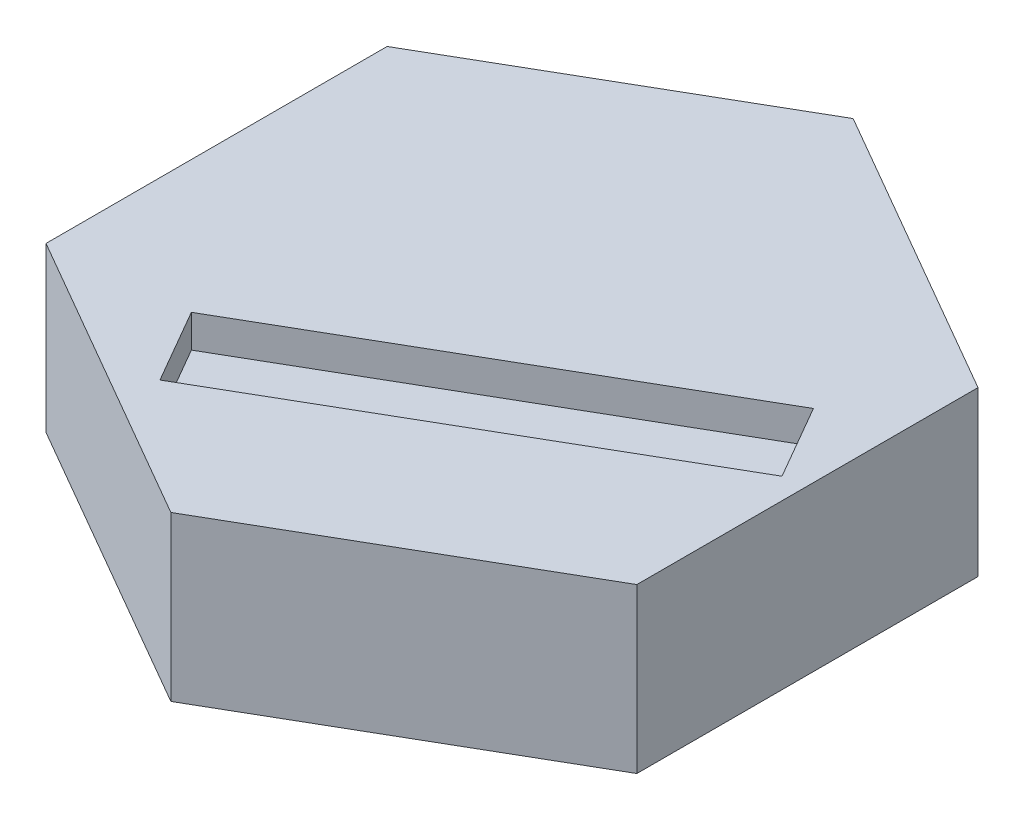
ISO-10303-21;
HEADER;
FILE_DESCRIPTION(('STEP AP214'),'2;1');
FILE_NAME('part.step','',(''),(''),'','','');
FILE_SCHEMA(('AUTOMOTIVE_DESIGN { 1 0 10303 214 1 1 1 1 }'));
ENDSEC;
DATA;
#1=APPLICATION_CONTEXT('core data for automotive mechanical design processes');
#2=APPLICATION_PROTOCOL_DEFINITION('international standard','automotive_design',2000,#1);
#3=PRODUCT_CONTEXT('',#1,'mechanical');
#4=PRODUCT('Part','Part','',(#3));
#5=PRODUCT_RELATED_PRODUCT_CATEGORY('part','',(#4));
#6=PRODUCT_DEFINITION_FORMATION('','',#4);
#7=PRODUCT_DEFINITION_CONTEXT('part definition',#1,'design');
#8=PRODUCT_DEFINITION('design','',#6,#7);
#9=PRODUCT_DEFINITION_SHAPE('','',#8);
#10=(LENGTH_UNIT() NAMED_UNIT(*) SI_UNIT(.MILLI.,.METRE.));
#11=(NAMED_UNIT(*) PLANE_ANGLE_UNIT() SI_UNIT($,.RADIAN.));
#12=(NAMED_UNIT(*) SI_UNIT($,.STERADIAN.) SOLID_ANGLE_UNIT());
#13=UNCERTAINTY_MEASURE_WITH_UNIT(LENGTH_MEASURE(1.E-05),#10,'distance_accuracy_value','');
#14=(GEOMETRIC_REPRESENTATION_CONTEXT(3) GLOBAL_UNCERTAINTY_ASSIGNED_CONTEXT((#13)) GLOBAL_UNIT_ASSIGNED_CONTEXT((#10,
#11,#12)) REPRESENTATION_CONTEXT('',''));
#15=CARTESIAN_POINT('',(0.,0.,0.));
#16=DIRECTION('',(0.,0.,1.));
#17=DIRECTION('',(1.,0.,0.));
#18=AXIS2_PLACEMENT_3D('',#15,#16,#17);
#19=CARTESIAN_POINT('',(0.,5.,0.));
#20=DIRECTION('',(0.,1.,0.));
#21=DIRECTION('',(0.,0.,1.));
#22=AXIS2_PLACEMENT_3D('',#19,#20,#21);
#23=PLANE('',#22);
#24=DIRECTION('',(0.,0.,-1.));
#25=VECTOR('',#24,1.);
#26=CARTESIAN_POINT('',(9.025,5.,5.21058617943637));
#27=LINE('',#26,#25);
#28=CARTESIAN_POINT('',(9.025,5.,5.21058617943637));
#29=VERTEX_POINT('',#28);
#30=CARTESIAN_POINT('',(9.025,5.,-5.21058617943637));
#31=VERTEX_POINT('',#30);
#32=EDGE_CURVE('E442',#29,#31,#27,.T.);
#33=ORIENTED_EDGE('',*,*,#32,.T.);
#34=DIRECTION('',(-0.866025403784439,0.,-0.5));
#35=VECTOR('',#34,1.);
#36=CARTESIAN_POINT('',(9.025,5.,-5.21058617943637));
#37=LINE('',#36,#35);
#38=CARTESIAN_POINT('',(0.,5.,-10.4211723588727));
#39=VERTEX_POINT('',#38);
#40=EDGE_CURVE('E445',#31,#39,#37,.T.);
#41=ORIENTED_EDGE('',*,*,#40,.T.);
#42=DIRECTION('',(-0.866025403784439,0.,0.5));
#43=VECTOR('',#42,1.);
#44=CARTESIAN_POINT('',(0.,5.,-10.4211723588727));
#45=LINE('',#44,#43);
#46=CARTESIAN_POINT('',(-9.025,5.,-5.21058617943638));
#47=VERTEX_POINT('',#46);
#48=EDGE_CURVE('E448',#39,#47,#45,.T.);
#49=ORIENTED_EDGE('',*,*,#48,.T.);
#50=DIRECTION('',(0.,0.,1.));
#51=VECTOR('',#50,1.);
#52=CARTESIAN_POINT('',(-9.025,5.,-5.21058617943638));
#53=LINE('',#52,#51);
#54=CARTESIAN_POINT('',(-9.025,5.,5.21058617943638));
#55=VERTEX_POINT('',#54);
#56=EDGE_CURVE('E450',#47,#55,#53,.T.);
#57=ORIENTED_EDGE('',*,*,#56,.T.);
#58=DIRECTION('',(0.866025403784439,0.,0.5));
#59=VECTOR('',#58,1.);
#60=CARTESIAN_POINT('',(-9.025,5.,5.21058617943638));
#61=LINE('',#60,#59);
#62=CARTESIAN_POINT('',(0.,5.,10.4211723588727));
#63=VERTEX_POINT('',#62);
#64=EDGE_CURVE('E452',#55,#63,#61,.T.);
#65=ORIENTED_EDGE('',*,*,#64,.T.);
#66=DIRECTION('',(0.866025403784439,0.,-0.5));
#67=VECTOR('',#66,1.);
#68=CARTESIAN_POINT('',(0.,5.,10.4211723588727));
#69=LINE('',#68,#67);
#70=EDGE_CURVE('E454',#63,#29,#69,.T.);
#71=ORIENTED_EDGE('',*,*,#70,.T.);
#72=EDGE_LOOP('',(#33,#41,#49,#57,#65,#71));
#73=FACE_BOUND('',#72,.T.);
#74=DIRECTION('',(-0.865938535675838,0.,0.500150429802459));
#75=VECTOR('',#74,1.);
#76=CARTESIAN_POINT('',(8.3754609018656,5.,0.127158722187314));
#77=LINE('',#76,#75);
#78=CARTESIAN_POINT('',(8.3754609018656,5.,0.127158722187314));
#79=VERTEX_POINT('',#78);
#80=CARTESIAN_POINT('',(-3.66981153403183,5.,7.08429013244372));
#81=VERTEX_POINT('',#80);
#82=EDGE_CURVE('E259',#79,#81,#77,.T.);
#83=ORIENTED_EDGE('',*,*,#82,.T.);
#84=DIRECTION('',(-0.500163094740808,0.,-0.865931220513094));
#85=VECTOR('',#84,1.);
#86=CARTESIAN_POINT('',(-3.66981153403183,5.,7.08429013244372));
#87=LINE('',#86,#85);
#88=CARTESIAN_POINT('',(-4.98191089300619,5.,4.81265551705911));
#89=VERTEX_POINT('',#88);
#90=EDGE_CURVE('E50',#81,#89,#87,.T.);
#91=ORIENTED_EDGE('',*,*,#90,.T.);
#92=DIRECTION('',(0.865938535675838,0.,-0.500150429802459));
#93=VECTOR('',#92,1.);
#94=CARTESIAN_POINT('',(-4.98191089300619,5.,4.81265551705911));
#95=LINE('',#94,#93);
#96=CARTESIAN_POINT('',(7.06336154289125,5.,-2.1444758931973));
#97=VERTEX_POINT('',#96);
#98=EDGE_CURVE('E263',#89,#97,#95,.T.);
#99=ORIENTED_EDGE('',*,*,#98,.T.);
#100=DIRECTION('',(0.500163094740808,0.,0.865931220513094));
#101=VECTOR('',#100,1.);
#102=CARTESIAN_POINT('',(7.06336154289125,5.,-2.1444758931973));
#103=LINE('',#102,#101);
#104=EDGE_CURVE('E885',#97,#79,#103,.T.);
#105=ORIENTED_EDGE('',*,*,#104,.T.);
#106=EDGE_LOOP('',(#83,#91,#99,#105));
#107=FACE_BOUND('',#106,.T.);
#108=ADVANCED_FACE('F35',(#73,#107),#23,.T.);
#109=CARTESIAN_POINT('',(0.,2.,0.));
#110=DIRECTION('',(0.,-1.,0.));
#111=DIRECTION('',(0.,0.,-1.));
#112=AXIS2_PLACEMENT_3D('',#109,#110,#111);
#113=PLANE('',#112);
#114=DIRECTION('',(0.866025403784439,0.,0.5));
#115=VECTOR('',#114,1.);
#116=CARTESIAN_POINT('',(0.,2.,-9.26647182049349));
#117=LINE('',#116,#115);
#118=CARTESIAN_POINT('',(0.,2.,-9.26647182049349));
#119=VERTEX_POINT('',#118);
#120=CARTESIAN_POINT('',(8.025,2.,-4.63323591024675));
#121=VERTEX_POINT('',#120);
#122=EDGE_CURVE('E393',#119,#121,#117,.T.);
#123=ORIENTED_EDGE('',*,*,#122,.T.);
#124=DIRECTION('',(0.,0.,1.));
#125=VECTOR('',#124,1.);
#126=CARTESIAN_POINT('',(8.025,2.,-4.63323591024675));
#127=LINE('',#126,#125);
#128=CARTESIAN_POINT('',(8.025,2.,4.63323591024675));
#129=VERTEX_POINT('',#128);
#130=EDGE_CURVE('E396',#121,#129,#127,.T.);
#131=ORIENTED_EDGE('',*,*,#130,.T.);
#132=DIRECTION('',(-0.866025403784439,0.,0.5));
#133=VECTOR('',#132,1.);
#134=CARTESIAN_POINT('',(8.025,2.,4.63323591024675));
#135=LINE('',#134,#133);
#136=CARTESIAN_POINT('',(0.,2.,9.26647182049349));
#137=VERTEX_POINT('',#136);
#138=EDGE_CURVE('E399',#129,#137,#135,.T.);
#139=ORIENTED_EDGE('',*,*,#138,.T.);
#140=DIRECTION('',(-0.866025403784439,0.,-0.5));
#141=VECTOR('',#140,1.);
#142=CARTESIAN_POINT('',(0.,2.,9.26647182049349));
#143=LINE('',#142,#141);
#144=CARTESIAN_POINT('',(-8.025,2.,4.63323591024675));
#145=VERTEX_POINT('',#144);
#146=EDGE_CURVE('E402',#137,#145,#143,.T.);
#147=ORIENTED_EDGE('',*,*,#146,.T.);
#148=DIRECTION('',(0.,0.,-1.));
#149=VECTOR('',#148,1.);
#150=CARTESIAN_POINT('',(-8.025,2.,4.63323591024675));
#151=LINE('',#150,#149);
#152=CARTESIAN_POINT('',(-8.025,2.,-4.63323591024675));
#153=VERTEX_POINT('',#152);
#154=EDGE_CURVE('E405',#145,#153,#151,.T.);
#155=ORIENTED_EDGE('',*,*,#154,.T.);
#156=DIRECTION('',(0.866025403784439,0.,-0.5));
#157=VECTOR('',#156,1.);
#158=CARTESIAN_POINT('',(-8.025,2.,-4.63323591024675));
#159=LINE('',#158,#157);
#160=EDGE_CURVE('E408',#153,#119,#159,.T.);
#161=ORIENTED_EDGE('',*,*,#160,.T.);
#162=EDGE_LOOP('',(#123,#131,#139,#147,#155,#161));
#163=FACE_BOUND('',#162,.T.);
#164=DIRECTION('',(-1.,0.,0.));
#165=VECTOR('',#164,1.);
#166=CARTESIAN_POINT('',(-3.4,2.,2.45));
#167=LINE('',#166,#165);
#168=CARTESIAN_POINT('',(3.4,2.,2.45));
#169=VERTEX_POINT('',#168);
#170=CARTESIAN_POINT('',(-3.4,2.,2.45));
#171=VERTEX_POINT('',#170);
#172=EDGE_CURVE('E378',#169,#171,#167,.T.);
#173=ORIENTED_EDGE('',*,*,#172,.F.);
#174=DIRECTION('',(0.,0.,1.));
#175=VECTOR('',#174,1.);
#176=CARTESIAN_POINT('',(3.4,2.,-2.45));
#177=LINE('',#176,#175);
#178=CARTESIAN_POINT('',(3.4,2.,-2.45));
#179=VERTEX_POINT('',#178);
#180=EDGE_CURVE('E343',#179,#169,#177,.T.);
#181=ORIENTED_EDGE('',*,*,#180,.F.);
#182=DIRECTION('',(1.,0.,0.));
#183=VECTOR('',#182,1.);
#184=CARTESIAN_POINT('',(-3.4,2.,-2.45));
#185=LINE('',#184,#183);
#186=CARTESIAN_POINT('',(-3.4,2.,-2.45));
#187=VERTEX_POINT('',#186);
#188=EDGE_CURVE('E369',#187,#179,#185,.T.);
#189=ORIENTED_EDGE('',*,*,#188,.F.);
#190=DIRECTION('',(0.,0.,-1.));
#191=VECTOR('',#190,1.);
#192=CARTESIAN_POINT('',(-3.4,2.,-2.45));
#193=LINE('',#192,#191);
#194=EDGE_CURVE('E380',#171,#187,#193,.T.);
#195=ORIENTED_EDGE('',*,*,#194,.F.);
#196=EDGE_LOOP('',(#173,#181,#189,#195));
#197=FACE_BOUND('',#196,.T.);
#198=ADVANCED_FACE('F521',(#163,#197),#113,.T.);
#199=CARTESIAN_POINT('',(9.025,5.,5.21058617943637));
#200=DIRECTION('',(-1.,0.,0.));
#201=DIRECTION('',(0.,0.,1.));
#202=AXIS2_PLACEMENT_3D('',#199,#200,#201);
#203=PLANE('',#202);
#204=DIRECTION('',(0.,0.,-1.));
#205=VECTOR('',#204,1.);
#206=CARTESIAN_POINT('',(9.025,0.,5.21058617943637));
#207=LINE('',#206,#205);
#208=CARTESIAN_POINT('',(9.025,0.,5.21058617943637));
#209=VERTEX_POINT('',#208);
#210=CARTESIAN_POINT('',(9.025,0.,-5.21058617943637));
#211=VERTEX_POINT('',#210);
#212=EDGE_CURVE('E414',#209,#211,#207,.T.);
#213=ORIENTED_EDGE('',*,*,#212,.T.);
#214=DIRECTION('',(0.,-1.,0.));
#215=VECTOR('',#214,1.);
#216=CARTESIAN_POINT('',(9.025,5.,-5.21058617943637));
#217=LINE('',#216,#215);
#218=EDGE_CURVE('E11',#31,#211,#217,.T.);
#219=ORIENTED_EDGE('',*,*,#218,.F.);
#220=ORIENTED_EDGE('',*,*,#32,.F.);
#221=DIRECTION('',(0.,-1.,0.));
#222=VECTOR('',#221,1.);
#223=CARTESIAN_POINT('',(9.025,5.,5.21058617943637));
#224=LINE('',#223,#222);
#225=EDGE_CURVE('E456',#29,#209,#224,.T.);
#226=ORIENTED_EDGE('',*,*,#225,.T.);
#227=EDGE_LOOP('',(#213,#219,#220,#226));
#228=FACE_BOUND('',#227,.T.);
#229=ADVANCED_FACE('F37',(#228),#203,.F.);
#230=CARTESIAN_POINT('',(9.025,5.,-5.21058617943637));
#231=DIRECTION('',(-0.5,0.,0.866025403784439));
#232=DIRECTION('',(0.866025403784439,0.,0.5));
#233=AXIS2_PLACEMENT_3D('',#230,#231,#232);
#234=PLANE('',#233);
#235=DIRECTION('',(-0.866025403784439,0.,-0.5));
#236=VECTOR('',#235,1.);
#237=CARTESIAN_POINT('',(9.025,0.,-5.21058617943637));
#238=LINE('',#237,#236);
#239=CARTESIAN_POINT('',(0.,0.,-10.4211723588727));
#240=VERTEX_POINT('',#239);
#241=EDGE_CURVE('E459',#211,#240,#238,.T.);
#242=ORIENTED_EDGE('',*,*,#241,.T.);
#243=DIRECTION('',(0.,-1.,0.));
#244=VECTOR('',#243,1.);
#245=CARTESIAN_POINT('',(0.,5.,-10.4211723588727));
#246=LINE('',#245,#244);
#247=EDGE_CURVE('E43',#39,#240,#246,.T.);
#248=ORIENTED_EDGE('',*,*,#247,.F.);
#249=ORIENTED_EDGE('',*,*,#40,.F.);
#250=ORIENTED_EDGE('',*,*,#218,.T.);
#251=EDGE_LOOP('',(#242,#248,#249,#250));
#252=FACE_BOUND('',#251,.T.);
#253=ADVANCED_FACE('F506',(#252),#234,.F.);
#254=CARTESIAN_POINT('',(0.,5.,-10.4211723588727));
#255=DIRECTION('',(0.5,0.,0.866025403784439));
#256=DIRECTION('',(0.866025403784439,0.,-0.5));
#257=AXIS2_PLACEMENT_3D('',#254,#255,#256);
#258=PLANE('',#257);
#259=DIRECTION('',(-0.866025403784439,0.,0.5));
#260=VECTOR('',#259,1.);
#261=CARTESIAN_POINT('',(0.,0.,-10.4211723588727));
#262=LINE('',#261,#260);
#263=CARTESIAN_POINT('',(-9.025,0.,-5.21058617943638));
#264=VERTEX_POINT('',#263);
#265=EDGE_CURVE('E461',#240,#264,#262,.T.);
#266=ORIENTED_EDGE('',*,*,#265,.T.);
#267=DIRECTION('',(0.,-1.,0.));
#268=VECTOR('',#267,1.);
#269=CARTESIAN_POINT('',(-9.025,5.,-5.21058617943638));
#270=LINE('',#269,#268);
#271=EDGE_CURVE('E476',#47,#264,#270,.T.);
#272=ORIENTED_EDGE('',*,*,#271,.F.);
#273=ORIENTED_EDGE('',*,*,#48,.F.);
#274=ORIENTED_EDGE('',*,*,#247,.T.);
#275=EDGE_LOOP('',(#266,#272,#273,#274));
#276=FACE_BOUND('',#275,.T.);
#277=ADVANCED_FACE('F483',(#276),#258,.F.);
#278=CARTESIAN_POINT('',(-9.025,5.,-5.21058617943638));
#279=DIRECTION('',(1.,0.,0.));
#280=DIRECTION('',(0.,0.,-1.));
#281=AXIS2_PLACEMENT_3D('',#278,#279,#280);
#282=PLANE('',#281);
#283=DIRECTION('',(0.,0.,1.));
#284=VECTOR('',#283,1.);
#285=CARTESIAN_POINT('',(-9.025,0.,-5.21058617943638));
#286=LINE('',#285,#284);
#287=CARTESIAN_POINT('',(-9.025,0.,5.21058617943638));
#288=VERTEX_POINT('',#287);
#289=EDGE_CURVE('E463',#264,#288,#286,.T.);
#290=ORIENTED_EDGE('',*,*,#289,.T.);
#291=DIRECTION('',(0.,-1.,0.));
#292=VECTOR('',#291,1.);
#293=CARTESIAN_POINT('',(-9.025,5.,5.21058617943638));
#294=LINE('',#293,#292);
#295=EDGE_CURVE('E473',#55,#288,#294,.T.);
#296=ORIENTED_EDGE('',*,*,#295,.F.);
#297=ORIENTED_EDGE('',*,*,#56,.F.);
#298=ORIENTED_EDGE('',*,*,#271,.T.);
#299=EDGE_LOOP('',(#290,#296,#297,#298));
#300=FACE_BOUND('',#299,.T.);
#301=ADVANCED_FACE('F494',(#300),#282,.F.);
#302=CARTESIAN_POINT('',(-9.025,5.,5.21058617943638));
#303=DIRECTION('',(0.5,0.,-0.866025403784439));
#304=DIRECTION('',(-0.866025403784439,0.,-0.5));
#305=AXIS2_PLACEMENT_3D('',#302,#303,#304);
#306=PLANE('',#305);
#307=DIRECTION('',(0.866025403784439,0.,0.5));
#308=VECTOR('',#307,1.);
#309=CARTESIAN_POINT('',(-9.025,0.,5.21058617943638));
#310=LINE('',#309,#308);
#311=CARTESIAN_POINT('',(0.,0.,10.4211723588727));
#312=VERTEX_POINT('',#311);
#313=EDGE_CURVE('E465',#288,#312,#310,.T.);
#314=ORIENTED_EDGE('',*,*,#313,.T.);
#315=DIRECTION('',(0.,-1.,0.));
#316=VECTOR('',#315,1.);
#317=CARTESIAN_POINT('',(0.,5.,10.4211723588727));
#318=LINE('',#317,#316);
#319=EDGE_CURVE('E470',#63,#312,#318,.T.);
#320=ORIENTED_EDGE('',*,*,#319,.F.);
#321=ORIENTED_EDGE('',*,*,#64,.F.);
#322=ORIENTED_EDGE('',*,*,#295,.T.);
#323=EDGE_LOOP('',(#314,#320,#321,#322));
#324=FACE_BOUND('',#323,.T.);
#325=ADVANCED_FACE('F498',(#324),#306,.F.);
#326=CARTESIAN_POINT('',(0.,5.,10.4211723588727));
#327=DIRECTION('',(-0.5,0.,-0.866025403784439));
#328=DIRECTION('',(-0.866025403784439,0.,0.5));
#329=AXIS2_PLACEMENT_3D('',#326,#327,#328);
#330=PLANE('',#329);
#331=DIRECTION('',(0.866025403784439,0.,-0.5));
#332=VECTOR('',#331,1.);
#333=CARTESIAN_POINT('',(0.,0.,10.4211723588727));
#334=LINE('',#333,#332);
#335=EDGE_CURVE('E446',#312,#209,#334,.T.);
#336=ORIENTED_EDGE('',*,*,#335,.T.);
#337=ORIENTED_EDGE('',*,*,#225,.F.);
#338=ORIENTED_EDGE('',*,*,#70,.F.);
#339=ORIENTED_EDGE('',*,*,#319,.T.);
#340=EDGE_LOOP('',(#336,#337,#338,#339));
#341=FACE_BOUND('',#340,.T.);
#342=ADVANCED_FACE('F509',(#341),#330,.F.);
#343=CARTESIAN_POINT('',(0.,0.,0.));
#344=DIRECTION('',(0.,1.,0.));
#345=DIRECTION('',(0.,0.,1.));
#346=AXIS2_PLACEMENT_3D('',#343,#344,#345);
#347=PLANE('',#346);
#348=DIRECTION('',(0.866025403784439,0.,-0.5));
#349=VECTOR('',#348,1.);
#350=CARTESIAN_POINT('',(-0.5,0.,9.55514695508831));
#351=LINE('',#350,#349);
#352=CARTESIAN_POINT('',(0.,0.,9.26647182049349));
#353=VERTEX_POINT('',#352);
#354=CARTESIAN_POINT('',(8.025,0.,4.63323591024675));
#355=VERTEX_POINT('',#354);
#356=EDGE_CURVE('E419',#353,#355,#351,.T.);
#357=ORIENTED_EDGE('',*,*,#356,.T.);
#358=DIRECTION('',(0.,0.,-1.));
#359=VECTOR('',#358,1.);
#360=CARTESIAN_POINT('',(8.025,0.,5.21058617943637));
#361=LINE('',#360,#359);
#362=CARTESIAN_POINT('',(8.025,0.,-4.63323591024675));
#363=VERTEX_POINT('',#362);
#364=EDGE_CURVE('E411',#355,#363,#361,.T.);
#365=ORIENTED_EDGE('',*,*,#364,.T.);
#366=DIRECTION('',(-0.866025403784439,0.,-0.5));
#367=VECTOR('',#366,1.);
#368=CARTESIAN_POINT('',(8.525,0.,-4.34456077565193));
#369=LINE('',#368,#367);
#370=CARTESIAN_POINT('',(0.,0.,-9.26647182049349));
#371=VERTEX_POINT('',#370);
#372=EDGE_CURVE('E428',#363,#371,#369,.T.);
#373=ORIENTED_EDGE('',*,*,#372,.T.);
#374=DIRECTION('',(-0.866025403784439,0.,0.5));
#375=VECTOR('',#374,1.);
#376=CARTESIAN_POINT('',(0.5,0.,-9.55514695508831));
#377=LINE('',#376,#375);
#378=CARTESIAN_POINT('',(-8.025,0.,-4.63323591024675));
#379=VERTEX_POINT('',#378);
#380=EDGE_CURVE('E437',#371,#379,#377,.T.);
#381=ORIENTED_EDGE('',*,*,#380,.T.);
#382=DIRECTION('',(0.,0.,1.));
#383=VECTOR('',#382,1.);
#384=CARTESIAN_POINT('',(-8.025,0.,-5.21058617943638));
#385=LINE('',#384,#383);
#386=CARTESIAN_POINT('',(-8.025,0.,4.63323591024675));
#387=VERTEX_POINT('',#386);
#388=EDGE_CURVE('E434',#379,#387,#385,.T.);
#389=ORIENTED_EDGE('',*,*,#388,.T.);
#390=DIRECTION('',(0.866025403784439,0.,0.5));
#391=VECTOR('',#390,1.);
#392=CARTESIAN_POINT('',(-8.525,0.,4.34456077565194));
#393=LINE('',#392,#391);
#394=EDGE_CURVE('E431',#387,#353,#393,.T.);
#395=ORIENTED_EDGE('',*,*,#394,.T.);
#396=EDGE_LOOP('',(#357,#365,#373,#381,#389,#395));
#397=FACE_BOUND('',#396,.T.);
#398=ORIENTED_EDGE('',*,*,#212,.F.);
#399=ORIENTED_EDGE('',*,*,#335,.F.);
#400=ORIENTED_EDGE('',*,*,#313,.F.);
#401=ORIENTED_EDGE('',*,*,#289,.F.);
#402=ORIENTED_EDGE('',*,*,#265,.F.);
#403=ORIENTED_EDGE('',*,*,#241,.F.);
#404=EDGE_LOOP('',(#398,#399,#400,#401,#402,#403));
#405=FACE_BOUND('',#404,.T.);
#406=ADVANCED_FACE('F489',(#397,#405),#347,.F.);
#407=CARTESIAN_POINT('',(8.025,5.,5.21058617943637));
#408=DIRECTION('',(-1.,0.,0.));
#409=DIRECTION('',(0.,0.,1.));
#410=AXIS2_PLACEMENT_3D('',#407,#408,#409);
#411=PLANE('',#410);
#412=ORIENTED_EDGE('',*,*,#130,.F.);
#413=DIRECTION('',(0.,-1.,0.));
#414=VECTOR('',#413,1.);
#415=CARTESIAN_POINT('',(8.025,5.,-4.63323591024675));
#416=LINE('',#415,#414);
#417=EDGE_CURVE('E412',#121,#363,#416,.T.);
#418=ORIENTED_EDGE('',*,*,#417,.T.);
#419=ORIENTED_EDGE('',*,*,#364,.F.);
#420=DIRECTION('',(0.,-1.,0.));
#421=VECTOR('',#420,1.);
#422=CARTESIAN_POINT('',(8.025,5.,4.63323591024675));
#423=LINE('',#422,#421);
#424=EDGE_CURVE('E416',#129,#355,#423,.T.);
#425=ORIENTED_EDGE('',*,*,#424,.F.);
#426=EDGE_LOOP('',(#412,#418,#419,#425));
#427=FACE_BOUND('',#426,.T.);
#428=ADVANCED_FACE('F516',(#427),#411,.T.);
#429=CARTESIAN_POINT('',(8.525,5.,-4.34456077565193));
#430=DIRECTION('',(-0.5,0.,0.866025403784439));
#431=DIRECTION('',(0.866025403784439,0.,0.5));
#432=AXIS2_PLACEMENT_3D('',#429,#430,#431);
#433=PLANE('',#432);
#434=ORIENTED_EDGE('',*,*,#122,.F.);
#435=DIRECTION('',(0.,-1.,0.));
#436=VECTOR('',#435,1.);
#437=CARTESIAN_POINT('',(0.,5.,-9.26647182049349));
#438=LINE('',#437,#436);
#439=EDGE_CURVE('E415',#119,#371,#438,.T.);
#440=ORIENTED_EDGE('',*,*,#439,.T.);
#441=ORIENTED_EDGE('',*,*,#372,.F.);
#442=ORIENTED_EDGE('',*,*,#417,.F.);
#443=EDGE_LOOP('',(#434,#440,#441,#442));
#444=FACE_BOUND('',#443,.T.);
#445=ADVANCED_FACE('F545',(#444),#433,.T.);
#446=CARTESIAN_POINT('',(0.5,5.,-9.55514695508831));
#447=DIRECTION('',(0.5,0.,0.866025403784439));
#448=DIRECTION('',(0.866025403784439,0.,-0.5));
#449=AXIS2_PLACEMENT_3D('',#446,#447,#448);
#450=PLANE('',#449);
#451=ORIENTED_EDGE('',*,*,#160,.F.);
#452=DIRECTION('',(0.,-1.,0.));
#453=VECTOR('',#452,1.);
#454=CARTESIAN_POINT('',(-8.025,5.,-4.63323591024675));
#455=LINE('',#454,#453);
#456=EDGE_CURVE('E421',#153,#379,#455,.T.);
#457=ORIENTED_EDGE('',*,*,#456,.T.);
#458=ORIENTED_EDGE('',*,*,#380,.F.);
#459=ORIENTED_EDGE('',*,*,#439,.F.);
#460=EDGE_LOOP('',(#451,#457,#458,#459));
#461=FACE_BOUND('',#460,.T.);
#462=ADVANCED_FACE('F541',(#461),#450,.T.);
#463=CARTESIAN_POINT('',(-8.025,5.,-5.21058617943638));
#464=DIRECTION('',(1.,0.,0.));
#465=DIRECTION('',(0.,0.,-1.));
#466=AXIS2_PLACEMENT_3D('',#463,#464,#465);
#467=PLANE('',#466);
#468=ORIENTED_EDGE('',*,*,#154,.F.);
#469=DIRECTION('',(0.,-1.,0.));
#470=VECTOR('',#469,1.);
#471=CARTESIAN_POINT('',(-8.025,5.,4.63323591024675));
#472=LINE('',#471,#470);
#473=EDGE_CURVE('E423',#145,#387,#472,.T.);
#474=ORIENTED_EDGE('',*,*,#473,.T.);
#475=ORIENTED_EDGE('',*,*,#388,.F.);
#476=ORIENTED_EDGE('',*,*,#456,.F.);
#477=EDGE_LOOP('',(#468,#474,#475,#476));
#478=FACE_BOUND('',#477,.T.);
#479=ADVANCED_FACE('F537',(#478),#467,.T.);
#480=CARTESIAN_POINT('',(-8.525,5.,4.34456077565194));
#481=DIRECTION('',(0.5,0.,-0.866025403784439));
#482=DIRECTION('',(-0.866025403784439,0.,-0.5));
#483=AXIS2_PLACEMENT_3D('',#480,#481,#482);
#484=PLANE('',#483);
#485=ORIENTED_EDGE('',*,*,#146,.F.);
#486=DIRECTION('',(0.,-1.,0.));
#487=VECTOR('',#486,1.);
#488=CARTESIAN_POINT('',(0.,5.,9.26647182049349));
#489=LINE('',#488,#487);
#490=EDGE_CURVE('E418',#137,#353,#489,.T.);
#491=ORIENTED_EDGE('',*,*,#490,.T.);
#492=ORIENTED_EDGE('',*,*,#394,.F.);
#493=ORIENTED_EDGE('',*,*,#473,.F.);
#494=EDGE_LOOP('',(#485,#491,#492,#493));
#495=FACE_BOUND('',#494,.T.);
#496=ADVANCED_FACE('F533',(#495),#484,.T.);
#497=CARTESIAN_POINT('',(-0.5,5.,9.55514695508831));
#498=DIRECTION('',(-0.5,0.,-0.866025403784439));
#499=DIRECTION('',(-0.866025403784439,0.,0.5));
#500=AXIS2_PLACEMENT_3D('',#497,#498,#499);
#501=PLANE('',#500);
#502=ORIENTED_EDGE('',*,*,#138,.F.);
#503=ORIENTED_EDGE('',*,*,#424,.T.);
#504=ORIENTED_EDGE('',*,*,#356,.F.);
#505=ORIENTED_EDGE('',*,*,#490,.F.);
#506=EDGE_LOOP('',(#502,#503,#504,#505));
#507=FACE_BOUND('',#506,.T.);
#508=ADVANCED_FACE('F529',(#507),#501,.T.);
#509=CARTESIAN_POINT('',(3.4,-1.5,-2.45));
#510=DIRECTION('',(-1.,0.,0.));
#511=DIRECTION('',(0.,0.,1.));
#512=AXIS2_PLACEMENT_3D('',#509,#510,#511);
#513=PLANE('',#512);
#514=ORIENTED_EDGE('',*,*,#180,.T.);
#515=DIRECTION('',(0.,1.,0.));
#516=VECTOR('',#515,1.);
#517=CARTESIAN_POINT('',(3.4,-1.5,2.45));
#518=LINE('',#517,#516);
#519=CARTESIAN_POINT('',(3.4,-1.5,2.45));
#520=VERTEX_POINT('',#519);
#521=EDGE_CURVE('E391',#520,#169,#518,.T.);
#522=ORIENTED_EDGE('',*,*,#521,.F.);
#523=DIRECTION('',(0.,0.,1.));
#524=VECTOR('',#523,1.);
#525=CARTESIAN_POINT('',(3.4,-1.5,-2.45));
#526=LINE('',#525,#524);
#527=CARTESIAN_POINT('',(3.4,-1.5,-2.45));
#528=VERTEX_POINT('',#527);
#529=EDGE_CURVE('E365',#528,#520,#526,.T.);
#530=ORIENTED_EDGE('',*,*,#529,.F.);
#531=DIRECTION('',(0.,1.,0.));
#532=VECTOR('',#531,1.);
#533=CARTESIAN_POINT('',(3.4,-1.5,-2.45));
#534=LINE('',#533,#532);
#535=EDGE_CURVE('E375',#528,#179,#534,.T.);
#536=ORIENTED_EDGE('',*,*,#535,.T.);
#537=EDGE_LOOP('',(#514,#522,#530,#536));
#538=FACE_BOUND('',#537,.T.);
#539=ADVANCED_FACE('F532',(#538),#513,.F.);
#540=CARTESIAN_POINT('',(-3.4,-1.5,2.45));
#541=DIRECTION('',(0.,0.,-1.));
#542=DIRECTION('',(-1.,0.,0.));
#543=AXIS2_PLACEMENT_3D('',#540,#541,#542);
#544=PLANE('',#543);
#545=ORIENTED_EDGE('',*,*,#172,.T.);
#546=DIRECTION('',(0.,1.,0.));
#547=VECTOR('',#546,1.);
#548=CARTESIAN_POINT('',(-3.4,-1.5,2.45));
#549=LINE('',#548,#547);
#550=CARTESIAN_POINT('',(-3.4,-1.5,2.45));
#551=VERTEX_POINT('',#550);
#552=EDGE_CURVE('E388',#551,#171,#549,.T.);
#553=ORIENTED_EDGE('',*,*,#552,.F.);
#554=DIRECTION('',(-1.,0.,0.));
#555=VECTOR('',#554,1.);
#556=CARTESIAN_POINT('',(-3.4,-1.5,2.45));
#557=LINE('',#556,#555);
#558=EDGE_CURVE('E368',#520,#551,#557,.T.);
#559=ORIENTED_EDGE('',*,*,#558,.F.);
#560=ORIENTED_EDGE('',*,*,#521,.T.);
#561=EDGE_LOOP('',(#545,#553,#559,#560));
#562=FACE_BOUND('',#561,.T.);
#563=ADVANCED_FACE('F555',(#562),#544,.F.);
#564=CARTESIAN_POINT('',(-3.4,-1.5,-2.45));
#565=DIRECTION('',(1.,0.,0.));
#566=DIRECTION('',(0.,0.,-1.));
#567=AXIS2_PLACEMENT_3D('',#564,#565,#566);
#568=PLANE('',#567);
#569=ORIENTED_EDGE('',*,*,#194,.T.);
#570=DIRECTION('',(0.,1.,0.));
#571=VECTOR('',#570,1.);
#572=CARTESIAN_POINT('',(-3.4,-1.5,-2.45));
#573=LINE('',#572,#571);
#574=CARTESIAN_POINT('',(-3.4,-1.5,-2.45));
#575=VERTEX_POINT('',#574);
#576=EDGE_CURVE('E386',#575,#187,#573,.T.);
#577=ORIENTED_EDGE('',*,*,#576,.F.);
#578=DIRECTION('',(0.,0.,-1.));
#579=VECTOR('',#578,1.);
#580=CARTESIAN_POINT('',(-3.4,-1.5,-2.45));
#581=LINE('',#580,#579);
#582=EDGE_CURVE('E371',#551,#575,#581,.T.);
#583=ORIENTED_EDGE('',*,*,#582,.F.);
#584=ORIENTED_EDGE('',*,*,#552,.T.);
#585=EDGE_LOOP('',(#569,#577,#583,#584));
#586=FACE_BOUND('',#585,.T.);
#587=ADVANCED_FACE('F559',(#586),#568,.F.);
#588=CARTESIAN_POINT('',(-3.4,-1.5,-2.45));
#589=DIRECTION('',(0.,0.,1.));
#590=DIRECTION('',(1.,0.,0.));
#591=AXIS2_PLACEMENT_3D('',#588,#589,#590);
#592=PLANE('',#591);
#593=ORIENTED_EDGE('',*,*,#188,.T.);
#594=ORIENTED_EDGE('',*,*,#535,.F.);
#595=DIRECTION('',(1.,0.,0.));
#596=VECTOR('',#595,1.);
#597=CARTESIAN_POINT('',(-3.4,-1.5,-2.45));
#598=LINE('',#597,#596);
#599=EDGE_CURVE('E373',#575,#528,#598,.T.);
#600=ORIENTED_EDGE('',*,*,#599,.F.);
#601=ORIENTED_EDGE('',*,*,#576,.T.);
#602=EDGE_LOOP('',(#593,#594,#600,#601));
#603=FACE_BOUND('',#602,.T.);
#604=ADVANCED_FACE('F563',(#603),#592,.F.);
#605=CARTESIAN_POINT('',(0.,-1.5,0.));
#606=DIRECTION('',(0.,1.,0.));
#607=DIRECTION('',(0.,0.,1.));
#608=AXIS2_PLACEMENT_3D('',#605,#606,#607);
#609=PLANE('',#608);
#610=DIRECTION('',(0.,0.,1.));
#611=VECTOR('',#610,1.);
#612=CARTESIAN_POINT('',(2.1,-1.5,-0.65));
#613=LINE('',#612,#611);
#614=CARTESIAN_POINT('',(2.1,-1.5,-0.65));
#615=VERTEX_POINT('',#614);
#616=CARTESIAN_POINT('',(2.1,-1.5,0.65));
#617=VERTEX_POINT('',#616);
#618=EDGE_CURVE('E266',#615,#617,#613,.T.);
#619=ORIENTED_EDGE('',*,*,#618,.F.);
#620=DIRECTION('',(1.,0.,0.));
#621=VECTOR('',#620,1.);
#622=CARTESIAN_POINT('',(0.75,-1.5,-0.65));
#623=LINE('',#622,#621);
#624=CARTESIAN_POINT('',(0.75,-1.5,-0.65));
#625=VERTEX_POINT('',#624);
#626=EDGE_CURVE('E58',#625,#615,#623,.T.);
#627=ORIENTED_EDGE('',*,*,#626,.F.);
#628=DIRECTION('',(0.,0.,1.));
#629=VECTOR('',#628,1.);
#630=CARTESIAN_POINT('',(0.75,-1.5,-2.1));
#631=LINE('',#630,#629);
#632=CARTESIAN_POINT('',(0.75,-1.5,-2.1));
#633=VERTEX_POINT('',#632);
#634=EDGE_CURVE('E276',#633,#625,#631,.T.);
#635=ORIENTED_EDGE('',*,*,#634,.F.);
#636=DIRECTION('',(1.,0.,0.));
#637=VECTOR('',#636,1.);
#638=CARTESIAN_POINT('',(-0.75,-1.5,-2.1));
#639=LINE('',#638,#637);
#640=CARTESIAN_POINT('',(-0.75,-1.5,-2.1));
#641=VERTEX_POINT('',#640);
#642=EDGE_CURVE('E336',#641,#633,#639,.T.);
#643=ORIENTED_EDGE('',*,*,#642,.F.);
#644=DIRECTION('',(0.,0.,-1.));
#645=VECTOR('',#644,1.);
#646=CARTESIAN_POINT('',(-0.75,-1.5,-2.1));
#647=LINE('',#646,#645);
#648=CARTESIAN_POINT('',(-0.75,-1.5,-0.65));
#649=VERTEX_POINT('',#648);
#650=EDGE_CURVE('E333',#649,#641,#647,.T.);
#651=ORIENTED_EDGE('',*,*,#650,.F.);
#652=DIRECTION('',(1.,0.,0.));
#653=VECTOR('',#652,1.);
#654=CARTESIAN_POINT('',(-0.75,-1.5,-0.65));
#655=LINE('',#654,#653);
#656=CARTESIAN_POINT('',(-2.1,-1.5,-0.65));
#657=VERTEX_POINT('',#656);
#658=EDGE_CURVE('E330',#657,#649,#655,.T.);
#659=ORIENTED_EDGE('',*,*,#658,.F.);
#660=DIRECTION('',(0.,0.,-1.));
#661=VECTOR('',#660,1.);
#662=CARTESIAN_POINT('',(-2.1,-1.5,-0.65));
#663=LINE('',#662,#661);
#664=CARTESIAN_POINT('',(-2.1,-1.5,0.65));
#665=VERTEX_POINT('',#664);
#666=EDGE_CURVE('E327',#665,#657,#663,.T.);
#667=ORIENTED_EDGE('',*,*,#666,.F.);
#668=DIRECTION('',(-1.,0.,0.));
#669=VECTOR('',#668,1.);
#670=CARTESIAN_POINT('',(-2.1,-1.5,0.65));
#671=LINE('',#670,#669);
#672=CARTESIAN_POINT('',(-0.75,-1.5,0.649999999999999));
#673=VERTEX_POINT('',#672);
#674=EDGE_CURVE('E324',#673,#665,#671,.T.);
#675=ORIENTED_EDGE('',*,*,#674,.F.);
#676=DIRECTION('',(0.,0.,-1.));
#677=VECTOR('',#676,1.);
#678=CARTESIAN_POINT('',(-0.75,-1.5,0.649999999999999));
#679=LINE('',#678,#677);
#680=CARTESIAN_POINT('',(-0.75,-1.5,2.1));
#681=VERTEX_POINT('',#680);
#682=EDGE_CURVE('E321',#681,#673,#679,.T.);
#683=ORIENTED_EDGE('',*,*,#682,.F.);
#684=DIRECTION('',(-1.,0.,0.));
#685=VECTOR('',#684,1.);
#686=CARTESIAN_POINT('',(-0.75,-1.5,2.1));
#687=LINE('',#686,#685);
#688=CARTESIAN_POINT('',(0.75,-1.5,2.1));
#689=VERTEX_POINT('',#688);
#690=EDGE_CURVE('E318',#689,#681,#687,.T.);
#691=ORIENTED_EDGE('',*,*,#690,.F.);
#692=DIRECTION('',(0.,0.,1.));
#693=VECTOR('',#692,1.);
#694=CARTESIAN_POINT('',(0.75,-1.5,2.1));
#695=LINE('',#694,#693);
#696=CARTESIAN_POINT('',(0.75,-1.5,0.65));
#697=VERTEX_POINT('',#696);
#698=EDGE_CURVE('E315',#697,#689,#695,.T.);
#699=ORIENTED_EDGE('',*,*,#698,.F.);
#700=DIRECTION('',(-1.,0.,0.));
#701=VECTOR('',#700,1.);
#702=CARTESIAN_POINT('',(0.75,-1.5,0.65));
#703=LINE('',#702,#701);
#704=EDGE_CURVE('E312',#617,#697,#703,.T.);
#705=ORIENTED_EDGE('',*,*,#704,.F.);
#706=EDGE_LOOP('',(#619,#627,#635,#643,#651,#659,#667,#675,#683,#691,#699,#705));
#707=FACE_BOUND('',#706,.T.);
#708=ORIENTED_EDGE('',*,*,#529,.T.);
#709=ORIENTED_EDGE('',*,*,#558,.T.);
#710=ORIENTED_EDGE('',*,*,#582,.T.);
#711=ORIENTED_EDGE('',*,*,#599,.T.);
#712=EDGE_LOOP('',(#708,#709,#710,#711));
#713=FACE_BOUND('',#712,.T.);
#714=ADVANCED_FACE('F567',(#707,#713),#609,.F.);
#715=CARTESIAN_POINT('',(0.75,2.,-0.65));
#716=DIRECTION('',(0.,0.,-1.));
#717=DIRECTION('',(-1.,0.,0.));
#718=AXIS2_PLACEMENT_3D('',#715,#716,#717);
#719=PLANE('',#718);
#720=ORIENTED_EDGE('',*,*,#626,.T.);
#721=DIRECTION('',(0.,-1.,0.));
#722=VECTOR('',#721,1.);
#723=CARTESIAN_POINT('',(2.1,2.,-0.65));
#724=LINE('',#723,#722);
#725=CARTESIAN_POINT('',(2.1,2.,-0.65));
#726=VERTEX_POINT('',#725);
#727=EDGE_CURVE('E308',#726,#615,#724,.T.);
#728=ORIENTED_EDGE('',*,*,#727,.F.);
#729=DIRECTION('',(1.,0.,0.));
#730=VECTOR('',#729,1.);
#731=CARTESIAN_POINT('',(0.75,2.,-0.65));
#732=LINE('',#731,#730);
#733=CARTESIAN_POINT('',(0.75,2.,-0.65));
#734=VERTEX_POINT('',#733);
#735=EDGE_CURVE('E272',#734,#726,#732,.T.);
#736=ORIENTED_EDGE('',*,*,#735,.F.);
#737=DIRECTION('',(0.,-1.,0.));
#738=VECTOR('',#737,1.);
#739=CARTESIAN_POINT('',(0.75,2.,-0.65));
#740=LINE('',#739,#738);
#741=EDGE_CURVE('E341',#734,#625,#740,.T.);
#742=ORIENTED_EDGE('',*,*,#741,.T.);
#743=EDGE_LOOP('',(#720,#728,#736,#742));
#744=FACE_BOUND('',#743,.T.);
#745=ADVANCED_FACE('F571',(#744),#719,.F.);
#746=CARTESIAN_POINT('',(0.75,2.,-2.1));
#747=DIRECTION('',(1.,0.,0.));
#748=DIRECTION('',(0.,0.,-1.));
#749=AXIS2_PLACEMENT_3D('',#746,#747,#748);
#750=PLANE('',#749);
#751=ORIENTED_EDGE('',*,*,#634,.T.);
#752=ORIENTED_EDGE('',*,*,#741,.F.);
#753=DIRECTION('',(0.,0.,1.));
#754=VECTOR('',#753,1.);
#755=CARTESIAN_POINT('',(0.75,2.,-2.1));
#756=LINE('',#755,#754);
#757=CARTESIAN_POINT('',(0.75,2.,-2.1));
#758=VERTEX_POINT('',#757);
#759=EDGE_CURVE('E306',#758,#734,#756,.T.);
#760=ORIENTED_EDGE('',*,*,#759,.F.);
#761=DIRECTION('',(0.,-1.,0.));
#762=VECTOR('',#761,1.);
#763=CARTESIAN_POINT('',(0.75,2.,-2.1));
#764=LINE('',#763,#762);
#765=EDGE_CURVE('E344',#758,#633,#764,.T.);
#766=ORIENTED_EDGE('',*,*,#765,.T.);
#767=EDGE_LOOP('',(#751,#752,#760,#766));
#768=FACE_BOUND('',#767,.T.);
#769=ADVANCED_FACE('F575',(#768),#750,.F.);
#770=CARTESIAN_POINT('',(-0.75,2.,-2.1));
#771=DIRECTION('',(0.,0.,-1.));
#772=DIRECTION('',(-1.,0.,0.));
#773=AXIS2_PLACEMENT_3D('',#770,#771,#772);
#774=PLANE('',#773);
#775=ORIENTED_EDGE('',*,*,#642,.T.);
#776=ORIENTED_EDGE('',*,*,#765,.F.);
#777=DIRECTION('',(1.,0.,0.));
#778=VECTOR('',#777,1.);
#779=CARTESIAN_POINT('',(-0.75,2.,-2.1));
#780=LINE('',#779,#778);
#781=CARTESIAN_POINT('',(-0.75,2.,-2.1));
#782=VERTEX_POINT('',#781);
#783=EDGE_CURVE('E303',#782,#758,#780,.T.);
#784=ORIENTED_EDGE('',*,*,#783,.F.);
#785=DIRECTION('',(0.,-1.,0.));
#786=VECTOR('',#785,1.);
#787=CARTESIAN_POINT('',(-0.75,2.,-2.1));
#788=LINE('',#787,#786);
#789=EDGE_CURVE('E346',#782,#641,#788,.T.);
#790=ORIENTED_EDGE('',*,*,#789,.T.);
#791=EDGE_LOOP('',(#775,#776,#784,#790));
#792=FACE_BOUND('',#791,.T.);
#793=ADVANCED_FACE('F612',(#792),#774,.F.);
#794=CARTESIAN_POINT('',(-0.75,2.,-2.1));
#795=DIRECTION('',(-1.,0.,0.));
#796=DIRECTION('',(0.,0.,1.));
#797=AXIS2_PLACEMENT_3D('',#794,#795,#796);
#798=PLANE('',#797);
#799=ORIENTED_EDGE('',*,*,#650,.T.);
#800=ORIENTED_EDGE('',*,*,#789,.F.);
#801=DIRECTION('',(0.,0.,-1.));
#802=VECTOR('',#801,1.);
#803=CARTESIAN_POINT('',(-0.75,2.,-2.1));
#804=LINE('',#803,#802);
#805=CARTESIAN_POINT('',(-0.75,2.,-0.65));
#806=VERTEX_POINT('',#805);
#807=EDGE_CURVE('E300',#806,#782,#804,.T.);
#808=ORIENTED_EDGE('',*,*,#807,.F.);
#809=DIRECTION('',(0.,-1.,0.));
#810=VECTOR('',#809,1.);
#811=CARTESIAN_POINT('',(-0.75,2.,-0.65));
#812=LINE('',#811,#810);
#813=EDGE_CURVE('E348',#806,#649,#812,.T.);
#814=ORIENTED_EDGE('',*,*,#813,.T.);
#815=EDGE_LOOP('',(#799,#800,#808,#814));
#816=FACE_BOUND('',#815,.T.);
#817=ADVANCED_FACE('F608',(#816),#798,.F.);
#818=CARTESIAN_POINT('',(-0.75,2.,-0.65));
#819=DIRECTION('',(0.,0.,-1.));
#820=DIRECTION('',(-1.,0.,0.));
#821=AXIS2_PLACEMENT_3D('',#818,#819,#820);
#822=PLANE('',#821);
#823=ORIENTED_EDGE('',*,*,#658,.T.);
#824=ORIENTED_EDGE('',*,*,#813,.F.);
#825=DIRECTION('',(1.,0.,0.));
#826=VECTOR('',#825,1.);
#827=CARTESIAN_POINT('',(-0.75,2.,-0.65));
#828=LINE('',#827,#826);
#829=CARTESIAN_POINT('',(-2.1,2.,-0.65));
#830=VERTEX_POINT('',#829);
#831=EDGE_CURVE('E297',#830,#806,#828,.T.);
#832=ORIENTED_EDGE('',*,*,#831,.F.);
#833=DIRECTION('',(0.,-1.,0.));
#834=VECTOR('',#833,1.);
#835=CARTESIAN_POINT('',(-2.1,2.,-0.65));
#836=LINE('',#835,#834);
#837=EDGE_CURVE('E350',#830,#657,#836,.T.);
#838=ORIENTED_EDGE('',*,*,#837,.T.);
#839=EDGE_LOOP('',(#823,#824,#832,#838));
#840=FACE_BOUND('',#839,.T.);
#841=ADVANCED_FACE('F604',(#840),#822,.F.);
#842=CARTESIAN_POINT('',(-2.1,2.,-0.65));
#843=DIRECTION('',(-1.,0.,0.));
#844=DIRECTION('',(0.,0.,1.));
#845=AXIS2_PLACEMENT_3D('',#842,#843,#844);
#846=PLANE('',#845);
#847=ORIENTED_EDGE('',*,*,#666,.T.);
#848=ORIENTED_EDGE('',*,*,#837,.F.);
#849=DIRECTION('',(0.,0.,-1.));
#850=VECTOR('',#849,1.);
#851=CARTESIAN_POINT('',(-2.1,2.,-0.65));
#852=LINE('',#851,#850);
#853=CARTESIAN_POINT('',(-2.1,2.,0.65));
#854=VERTEX_POINT('',#853);
#855=EDGE_CURVE('E294',#854,#830,#852,.T.);
#856=ORIENTED_EDGE('',*,*,#855,.F.);
#857=DIRECTION('',(0.,-1.,0.));
#858=VECTOR('',#857,1.);
#859=CARTESIAN_POINT('',(-2.1,2.,0.65));
#860=LINE('',#859,#858);
#861=EDGE_CURVE('E352',#854,#665,#860,.T.);
#862=ORIENTED_EDGE('',*,*,#861,.T.);
#863=EDGE_LOOP('',(#847,#848,#856,#862));
#864=FACE_BOUND('',#863,.T.);
#865=ADVANCED_FACE('F600',(#864),#846,.F.);
#866=CARTESIAN_POINT('',(-2.1,2.,0.65));
#867=DIRECTION('',(0.,0.,1.));
#868=DIRECTION('',(1.,0.,0.));
#869=AXIS2_PLACEMENT_3D('',#866,#867,#868);
#870=PLANE('',#869);
#871=ORIENTED_EDGE('',*,*,#674,.T.);
#872=ORIENTED_EDGE('',*,*,#861,.F.);
#873=DIRECTION('',(-1.,0.,0.));
#874=VECTOR('',#873,1.);
#875=CARTESIAN_POINT('',(-2.1,2.,0.65));
#876=LINE('',#875,#874);
#877=CARTESIAN_POINT('',(-0.75,2.,0.649999999999999));
#878=VERTEX_POINT('',#877);
#879=EDGE_CURVE('E291',#878,#854,#876,.T.);
#880=ORIENTED_EDGE('',*,*,#879,.F.);
#881=DIRECTION('',(0.,-1.,0.));
#882=VECTOR('',#881,1.);
#883=CARTESIAN_POINT('',(-0.75,2.,0.649999999999999));
#884=LINE('',#883,#882);
#885=EDGE_CURVE('E354',#878,#673,#884,.T.);
#886=ORIENTED_EDGE('',*,*,#885,.T.);
#887=EDGE_LOOP('',(#871,#872,#880,#886));
#888=FACE_BOUND('',#887,.T.);
#889=ADVANCED_FACE('F596',(#888),#870,.F.);
#890=CARTESIAN_POINT('',(-0.75,2.,0.649999999999999));
#891=DIRECTION('',(-1.,0.,0.));
#892=DIRECTION('',(0.,0.,1.));
#893=AXIS2_PLACEMENT_3D('',#890,#891,#892);
#894=PLANE('',#893);
#895=ORIENTED_EDGE('',*,*,#682,.T.);
#896=ORIENTED_EDGE('',*,*,#885,.F.);
#897=DIRECTION('',(0.,0.,-1.));
#898=VECTOR('',#897,1.);
#899=CARTESIAN_POINT('',(-0.75,2.,0.649999999999999));
#900=LINE('',#899,#898);
#901=CARTESIAN_POINT('',(-0.75,2.,2.1));
#902=VERTEX_POINT('',#901);
#903=EDGE_CURVE('E288',#902,#878,#900,.T.);
#904=ORIENTED_EDGE('',*,*,#903,.F.);
#905=DIRECTION('',(0.,-1.,0.));
#906=VECTOR('',#905,1.);
#907=CARTESIAN_POINT('',(-0.75,2.,2.1));
#908=LINE('',#907,#906);
#909=EDGE_CURVE('E356',#902,#681,#908,.T.);
#910=ORIENTED_EDGE('',*,*,#909,.T.);
#911=EDGE_LOOP('',(#895,#896,#904,#910));
#912=FACE_BOUND('',#911,.T.);
#913=ADVANCED_FACE('F592',(#912),#894,.F.);
#914=CARTESIAN_POINT('',(-0.75,2.,2.1));
#915=DIRECTION('',(0.,0.,1.));
#916=DIRECTION('',(1.,0.,0.));
#917=AXIS2_PLACEMENT_3D('',#914,#915,#916);
#918=PLANE('',#917);
#919=ORIENTED_EDGE('',*,*,#690,.T.);
#920=ORIENTED_EDGE('',*,*,#909,.F.);
#921=DIRECTION('',(-1.,0.,0.));
#922=VECTOR('',#921,1.);
#923=CARTESIAN_POINT('',(-0.75,2.,2.1));
#924=LINE('',#923,#922);
#925=CARTESIAN_POINT('',(0.75,2.,2.1));
#926=VERTEX_POINT('',#925);
#927=EDGE_CURVE('E285',#926,#902,#924,.T.);
#928=ORIENTED_EDGE('',*,*,#927,.F.);
#929=DIRECTION('',(0.,-1.,0.));
#930=VECTOR('',#929,1.);
#931=CARTESIAN_POINT('',(0.75,2.,2.1));
#932=LINE('',#931,#930);
#933=EDGE_CURVE('E358',#926,#689,#932,.T.);
#934=ORIENTED_EDGE('',*,*,#933,.T.);
#935=EDGE_LOOP('',(#919,#920,#928,#934));
#936=FACE_BOUND('',#935,.T.);
#937=ADVANCED_FACE('F588',(#936),#918,.F.);
#938=CARTESIAN_POINT('',(0.75,2.,2.1));
#939=DIRECTION('',(1.,0.,0.));
#940=DIRECTION('',(0.,0.,-1.));
#941=AXIS2_PLACEMENT_3D('',#938,#939,#940);
#942=PLANE('',#941);
#943=ORIENTED_EDGE('',*,*,#698,.T.);
#944=ORIENTED_EDGE('',*,*,#933,.F.);
#945=DIRECTION('',(0.,0.,1.));
#946=VECTOR('',#945,1.);
#947=CARTESIAN_POINT('',(0.75,2.,2.1));
#948=LINE('',#947,#946);
#949=CARTESIAN_POINT('',(0.75,2.,0.65));
#950=VERTEX_POINT('',#949);
#951=EDGE_CURVE('E282',#950,#926,#948,.T.);
#952=ORIENTED_EDGE('',*,*,#951,.F.);
#953=DIRECTION('',(0.,-1.,0.));
#954=VECTOR('',#953,1.);
#955=CARTESIAN_POINT('',(0.75,2.,0.65));
#956=LINE('',#955,#954);
#957=EDGE_CURVE('E360',#950,#697,#956,.T.);
#958=ORIENTED_EDGE('',*,*,#957,.T.);
#959=EDGE_LOOP('',(#943,#944,#952,#958));
#960=FACE_BOUND('',#959,.T.);
#961=ADVANCED_FACE('F584',(#960),#942,.F.);
#962=CARTESIAN_POINT('',(0.75,2.,0.65));
#963=DIRECTION('',(0.,0.,1.));
#964=DIRECTION('',(1.,0.,0.));
#965=AXIS2_PLACEMENT_3D('',#962,#963,#964);
#966=PLANE('',#965);
#967=ORIENTED_EDGE('',*,*,#704,.T.);
#968=ORIENTED_EDGE('',*,*,#957,.F.);
#969=DIRECTION('',(-1.,0.,0.));
#970=VECTOR('',#969,1.);
#971=CARTESIAN_POINT('',(0.75,2.,0.65));
#972=LINE('',#971,#970);
#973=CARTESIAN_POINT('',(2.1,2.,0.65));
#974=VERTEX_POINT('',#973);
#975=EDGE_CURVE('E279',#974,#950,#972,.T.);
#976=ORIENTED_EDGE('',*,*,#975,.F.);
#977=DIRECTION('',(0.,-1.,0.));
#978=VECTOR('',#977,1.);
#979=CARTESIAN_POINT('',(2.1,2.,0.65));
#980=LINE('',#979,#978);
#981=EDGE_CURVE('E362',#974,#617,#980,.T.);
#982=ORIENTED_EDGE('',*,*,#981,.T.);
#983=EDGE_LOOP('',(#967,#968,#976,#982));
#984=FACE_BOUND('',#983,.T.);
#985=ADVANCED_FACE('F580',(#984),#966,.F.);
#986=CARTESIAN_POINT('',(2.1,2.,-0.65));
#987=DIRECTION('',(1.,0.,0.));
#988=DIRECTION('',(0.,0.,-1.));
#989=AXIS2_PLACEMENT_3D('',#986,#987,#988);
#990=PLANE('',#989);
#991=ORIENTED_EDGE('',*,*,#618,.T.);
#992=ORIENTED_EDGE('',*,*,#981,.F.);
#993=DIRECTION('',(0.,0.,1.));
#994=VECTOR('',#993,1.);
#995=CARTESIAN_POINT('',(2.1,2.,-0.65));
#996=LINE('',#995,#994);
#997=EDGE_CURVE('E275',#726,#974,#996,.T.);
#998=ORIENTED_EDGE('',*,*,#997,.F.);
#999=ORIENTED_EDGE('',*,*,#727,.T.);
#1000=EDGE_LOOP('',(#991,#992,#998,#999));
#1001=FACE_BOUND('',#1000,.T.);
#1002=ADVANCED_FACE('F576',(#1001),#990,.F.);
#1003=CARTESIAN_POINT('',(0.,2.,0.));
#1004=DIRECTION('',(0.,-1.,0.));
#1005=DIRECTION('',(0.,0.,-1.));
#1006=AXIS2_PLACEMENT_3D('',#1003,#1004,#1005);
#1007=PLANE('',#1006);
#1008=ORIENTED_EDGE('',*,*,#735,.T.);
#1009=ORIENTED_EDGE('',*,*,#997,.T.);
#1010=ORIENTED_EDGE('',*,*,#975,.T.);
#1011=ORIENTED_EDGE('',*,*,#951,.T.);
#1012=ORIENTED_EDGE('',*,*,#927,.T.);
#1013=ORIENTED_EDGE('',*,*,#903,.T.);
#1014=ORIENTED_EDGE('',*,*,#879,.T.);
#1015=ORIENTED_EDGE('',*,*,#855,.T.);
#1016=ORIENTED_EDGE('',*,*,#831,.T.);
#1017=ORIENTED_EDGE('',*,*,#807,.T.);
#1018=ORIENTED_EDGE('',*,*,#783,.T.);
#1019=ORIENTED_EDGE('',*,*,#759,.T.);
#1020=EDGE_LOOP('',(#1008,#1009,#1010,#1011,#1012,#1013,#1014,#1015,#1016,#1017,#1018,#1019));
#1021=FACE_BOUND('',#1020,.T.);
#1022=ADVANCED_FACE('F579',(#1021),#1007,.T.);
#1023=CARTESIAN_POINT('',(-3.66981153403183,4.,7.08429013244372));
#1024=DIRECTION('',(0.865931220513094,0.,-0.500163094740808));
#1025=DIRECTION('',(-0.500163094740808,0.,-0.865931220513094));
#1026=AXIS2_PLACEMENT_3D('',#1023,#1024,#1025);
#1027=PLANE('',#1026);
#1028=ORIENTED_EDGE('',*,*,#90,.F.);
#1029=DIRECTION('',(0.,1.,0.));
#1030=VECTOR('',#1029,1.);
#1031=CARTESIAN_POINT('',(-3.66981153403183,4.,7.08429013244372));
#1032=LINE('',#1031,#1030);
#1033=CARTESIAN_POINT('',(-3.66981153403183,4.,7.08429013244372));
#1034=VERTEX_POINT('',#1033);
#1035=EDGE_CURVE('E258',#1034,#81,#1032,.T.);
#1036=ORIENTED_EDGE('',*,*,#1035,.F.);
#1037=DIRECTION('',(-0.500163094740808,0.,-0.865931220513094));
#1038=VECTOR('',#1037,1.);
#1039=CARTESIAN_POINT('',(-3.66981153403183,4.,7.08429013244372));
#1040=LINE('',#1039,#1038);
#1041=CARTESIAN_POINT('',(-4.98191089300619,4.,4.81265551705911));
#1042=VERTEX_POINT('',#1041);
#1043=EDGE_CURVE('E250',#1034,#1042,#1040,.T.);
#1044=ORIENTED_EDGE('',*,*,#1043,.T.);
#1045=DIRECTION('',(0.,1.,0.));
#1046=VECTOR('',#1045,1.);
#1047=CARTESIAN_POINT('',(-4.98191089300619,4.,4.81265551705911));
#1048=LINE('',#1047,#1046);
#1049=EDGE_CURVE('E257',#1042,#89,#1048,.T.);
#1050=ORIENTED_EDGE('',*,*,#1049,.T.);
#1051=EDGE_LOOP('',(#1028,#1036,#1044,#1050));
#1052=FACE_BOUND('',#1051,.T.);
#1053=ADVANCED_FACE('F256',(#1052),#1027,.T.);
#1054=CARTESIAN_POINT('',(-4.98191089300619,4.,4.81265551705911));
#1055=DIRECTION('',(0.500150429802459,0.,0.865938535675838));
#1056=DIRECTION('',(0.865938535675838,0.,-0.500150429802459));
#1057=AXIS2_PLACEMENT_3D('',#1054,#1055,#1056);
#1058=PLANE('',#1057);
#1059=ORIENTED_EDGE('',*,*,#98,.F.);
#1060=ORIENTED_EDGE('',*,*,#1049,.F.);
#1061=DIRECTION('',(0.865938535675838,0.,-0.500150429802459));
#1062=VECTOR('',#1061,1.);
#1063=CARTESIAN_POINT('',(-4.98191089300619,4.,4.81265551705911));
#1064=LINE('',#1063,#1062);
#1065=CARTESIAN_POINT('',(7.06336154289125,4.,-2.1444758931973));
#1066=VERTEX_POINT('',#1065);
#1067=EDGE_CURVE('E246',#1042,#1066,#1064,.T.);
#1068=ORIENTED_EDGE('',*,*,#1067,.T.);
#1069=DIRECTION('',(0.,1.,0.));
#1070=VECTOR('',#1069,1.);
#1071=CARTESIAN_POINT('',(7.06336154289125,4.,-2.1444758931973));
#1072=LINE('',#1071,#1070);
#1073=EDGE_CURVE('E264',#1066,#97,#1072,.T.);
#1074=ORIENTED_EDGE('',*,*,#1073,.T.);
#1075=EDGE_LOOP('',(#1059,#1060,#1068,#1074));
#1076=FACE_BOUND('',#1075,.T.);
#1077=ADVANCED_FACE('F261',(#1076),#1058,.T.);
#1078=CARTESIAN_POINT('',(7.06336154289125,4.,-2.1444758931973));
#1079=DIRECTION('',(-0.865931220513094,0.,0.500163094740808));
#1080=DIRECTION('',(0.500163094740808,0.,0.865931220513094));
#1081=AXIS2_PLACEMENT_3D('',#1078,#1079,#1080);
#1082=PLANE('',#1081);
#1083=ORIENTED_EDGE('',*,*,#104,.F.);
#1084=ORIENTED_EDGE('',*,*,#1073,.F.);
#1085=DIRECTION('',(0.500163094740808,0.,0.865931220513094));
#1086=VECTOR('',#1085,1.);
#1087=CARTESIAN_POINT('',(7.06336154289125,4.,-2.1444758931973));
#1088=LINE('',#1087,#1086);
#1089=CARTESIAN_POINT('',(8.3754609018656,4.,0.127158722187314));
#1090=VERTEX_POINT('',#1089);
#1091=EDGE_CURVE('E251',#1066,#1090,#1088,.T.);
#1092=ORIENTED_EDGE('',*,*,#1091,.T.);
#1093=DIRECTION('',(0.,1.,0.));
#1094=VECTOR('',#1093,1.);
#1095=CARTESIAN_POINT('',(8.3754609018656,4.,0.127158722187314));
#1096=LINE('',#1095,#1094);
#1097=EDGE_CURVE('E268',#1090,#79,#1096,.T.);
#1098=ORIENTED_EDGE('',*,*,#1097,.T.);
#1099=EDGE_LOOP('',(#1083,#1084,#1092,#1098));
#1100=FACE_BOUND('',#1099,.T.);
#1101=ADVANCED_FACE('F627',(#1100),#1082,.T.);
#1102=CARTESIAN_POINT('',(8.3754609018656,4.,0.127158722187314));
#1103=DIRECTION('',(-0.500150429802459,0.,-0.865938535675838));
#1104=DIRECTION('',(-0.865938535675838,0.,0.500150429802459));
#1105=AXIS2_PLACEMENT_3D('',#1102,#1103,#1104);
#1106=PLANE('',#1105);
#1107=ORIENTED_EDGE('',*,*,#82,.F.);
#1108=ORIENTED_EDGE('',*,*,#1097,.F.);
#1109=DIRECTION('',(-0.865938535675838,0.,0.500150429802459));
#1110=VECTOR('',#1109,1.);
#1111=CARTESIAN_POINT('',(8.3754609018656,4.,0.127158722187314));
#1112=LINE('',#1111,#1110);
#1113=EDGE_CURVE('E892',#1090,#1034,#1112,.T.);
#1114=ORIENTED_EDGE('',*,*,#1113,.T.);
#1115=ORIENTED_EDGE('',*,*,#1035,.T.);
#1116=EDGE_LOOP('',(#1107,#1108,#1114,#1115));
#1117=FACE_BOUND('',#1116,.T.);
#1118=ADVANCED_FACE('F630',(#1117),#1106,.T.);
#1119=CARTESIAN_POINT('',(0.,4.,0.));
#1120=DIRECTION('',(0.,-1.,0.));
#1121=DIRECTION('',(0.,0.,-1.));
#1122=AXIS2_PLACEMENT_3D('',#1119,#1120,#1121);
#1123=PLANE('',#1122);
#1124=ORIENTED_EDGE('',*,*,#1043,.F.);
#1125=ORIENTED_EDGE('',*,*,#1113,.F.);
#1126=ORIENTED_EDGE('',*,*,#1091,.F.);
#1127=ORIENTED_EDGE('',*,*,#1067,.F.);
#1128=EDGE_LOOP('',(#1124,#1125,#1126,#1127));
#1129=FACE_BOUND('',#1128,.T.);
#1130=ADVANCED_FACE('F248',(#1129),#1123,.F.);
#1131=CLOSED_SHELL('',(#108,#198,#229,#253,#277,#301,#325,#342,#406,#428,#445,#462,#479,#496,
#508,#539,#563,#587,#604,#714,#745,#769,#793,#817,#841,#865,#889,#913,#937,#961,#985,#1002,
#1022,#1053,#1077,#1101,#1118,#1130));
#1132=MANIFOLD_SOLID_BREP('B2',#1131);
#1133=ADVANCED_BREP_SHAPE_REPRESENTATION('',(#18,#1132),#14);
#1134=SHAPE_DEFINITION_REPRESENTATION(#9,#1133);
ENDSEC;
END-ISO-10303-21;
